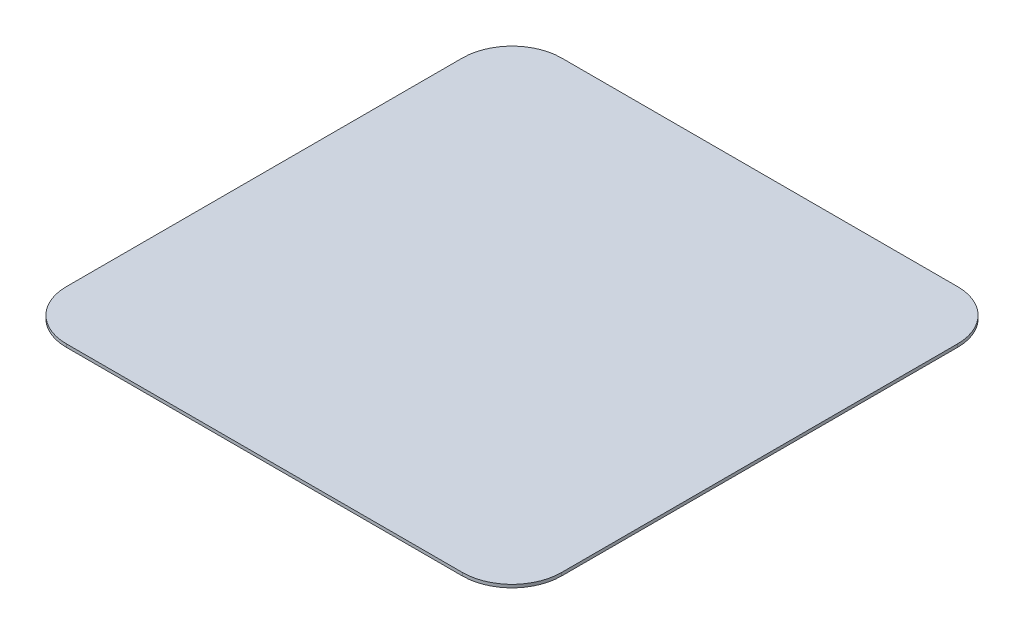
ISO-10303-21;
HEADER;
FILE_DESCRIPTION(('STEP AP214'),'2;1');
FILE_NAME('part.step','',(''),(''),'','','');
FILE_SCHEMA(('AUTOMOTIVE_DESIGN { 1 0 10303 214 1 1 1 1 }'));
ENDSEC;
DATA;
#1=APPLICATION_CONTEXT('core data for automotive mechanical design processes');
#2=APPLICATION_PROTOCOL_DEFINITION('international standard','automotive_design',2000,#1);
#3=PRODUCT_CONTEXT('',#1,'mechanical');
#4=PRODUCT('Part','Part','',(#3));
#5=PRODUCT_RELATED_PRODUCT_CATEGORY('part','',(#4));
#6=PRODUCT_DEFINITION_FORMATION('','',#4);
#7=PRODUCT_DEFINITION_CONTEXT('part definition',#1,'design');
#8=PRODUCT_DEFINITION('design','',#6,#7);
#9=PRODUCT_DEFINITION_SHAPE('','',#8);
#10=(LENGTH_UNIT() NAMED_UNIT(*) SI_UNIT(.MILLI.,.METRE.));
#11=(NAMED_UNIT(*) PLANE_ANGLE_UNIT() SI_UNIT($,.RADIAN.));
#12=(NAMED_UNIT(*) SI_UNIT($,.STERADIAN.) SOLID_ANGLE_UNIT());
#13=UNCERTAINTY_MEASURE_WITH_UNIT(LENGTH_MEASURE(1.E-05),#10,'distance_accuracy_value','');
#14=(GEOMETRIC_REPRESENTATION_CONTEXT(3) GLOBAL_UNCERTAINTY_ASSIGNED_CONTEXT((#13)) GLOBAL_UNIT_ASSIGNED_CONTEXT((#10,
#11,#12)) REPRESENTATION_CONTEXT('',''));
#15=CARTESIAN_POINT('',(0.,0.,0.));
#16=DIRECTION('',(0.,0.,1.));
#17=DIRECTION('',(1.,0.,0.));
#18=AXIS2_PLACEMENT_3D('',#15,#16,#17);
#19=CARTESIAN_POINT('',(47.5808065608511,26.1212463535826,-65.0344357125784));
#20=DIRECTION('',(0.,-1.,0.));
#21=DIRECTION('',(0.,0.,-1.));
#22=AXIS2_PLACEMENT_3D('',#19,#20,#21);
#23=CYLINDRICAL_SURFACE('',#22,12.7);
#24=CARTESIAN_POINT('',(47.5808065608511,25.3274963535826,-65.0344357125784));
#25=DIRECTION('',(0.,1.,0.));
#26=DIRECTION('',(0.,0.,1.));
#27=AXIS2_PLACEMENT_3D('',#24,#25,#26);
#28=CIRCLE('',#27,12.7);
#29=CARTESIAN_POINT('',(60.2808065608511,25.3274963535826,-65.0344357125784));
#30=VERTEX_POINT('',#29);
#31=CARTESIAN_POINT('',(47.5808065608511,25.3274963535826,-77.7344357125784));
#32=VERTEX_POINT('',#31);
#33=EDGE_CURVE('E129',#30,#32,#28,.T.);
#34=ORIENTED_EDGE('',*,*,#33,.T.);
#35=DIRECTION('',(0.,-1.,0.));
#36=VECTOR('',#35,1.);
#37=CARTESIAN_POINT('',(47.5808065608511,26.1212463535826,-77.7344357125784));
#38=LINE('',#37,#36);
#39=CARTESIAN_POINT('',(47.5808065608511,26.1212463535826,-77.7344357125784));
#40=VERTEX_POINT('',#39);
#41=EDGE_CURVE('E11',#40,#32,#38,.T.);
#42=ORIENTED_EDGE('',*,*,#41,.F.);
#43=CARTESIAN_POINT('',(47.5808065608511,26.1212463535826,-65.0344357125784));
#44=DIRECTION('',(0.,1.,0.));
#45=DIRECTION('',(0.,0.,1.));
#46=AXIS2_PLACEMENT_3D('',#43,#44,#45);
#47=CIRCLE('',#46,12.7);
#48=CARTESIAN_POINT('',(60.2808065608511,26.1212463535826,-65.0344357125784));
#49=VERTEX_POINT('',#48);
#50=EDGE_CURVE('E143',#49,#40,#47,.T.);
#51=ORIENTED_EDGE('',*,*,#50,.F.);
#52=DIRECTION('',(0.,-1.,0.));
#53=VECTOR('',#52,1.);
#54=CARTESIAN_POINT('',(60.2808065608511,26.1212463535826,-65.0344357125784));
#55=LINE('',#54,#53);
#56=EDGE_CURVE('E125',#49,#30,#55,.T.);
#57=ORIENTED_EDGE('',*,*,#56,.T.);
#58=EDGE_LOOP('',(#34,#42,#51,#57));
#59=FACE_BOUND('',#58,.T.);
#60=ADVANCED_FACE('F33',(#59),#23,.T.);
#61=CARTESIAN_POINT('',(47.5808065608511,26.1212463535826,-77.7344357125784));
#62=DIRECTION('',(0.,0.,1.));
#63=DIRECTION('',(1.,0.,0.));
#64=AXIS2_PLACEMENT_3D('',#61,#62,#63);
#65=PLANE('',#64);
#66=DIRECTION('',(-1.,0.,0.));
#67=VECTOR('',#66,1.);
#68=CARTESIAN_POINT('',(47.5808065608511,25.3274963535826,-77.7344357125784));
#69=LINE('',#68,#67);
#70=CARTESIAN_POINT('',(-54.0191934391488,25.3274963535826,-77.7344357125784));
#71=VERTEX_POINT('',#70);
#72=EDGE_CURVE('E132',#32,#71,#69,.T.);
#73=ORIENTED_EDGE('',*,*,#72,.T.);
#74=DIRECTION('',(0.,-1.,0.));
#75=VECTOR('',#74,1.);
#76=CARTESIAN_POINT('',(-54.0191934391488,26.1212463535826,-77.7344357125784));
#77=LINE('',#76,#75);
#78=CARTESIAN_POINT('',(-54.0191934391488,26.1212463535826,-77.7344357125784));
#79=VERTEX_POINT('',#78);
#80=EDGE_CURVE('E41',#79,#71,#77,.T.);
#81=ORIENTED_EDGE('',*,*,#80,.F.);
#82=DIRECTION('',(-1.,0.,0.));
#83=VECTOR('',#82,1.);
#84=CARTESIAN_POINT('',(47.5808065608511,26.1212463535826,-77.7344357125784));
#85=LINE('',#84,#83);
#86=EDGE_CURVE('E92',#40,#79,#85,.T.);
#87=ORIENTED_EDGE('',*,*,#86,.F.);
#88=ORIENTED_EDGE('',*,*,#41,.T.);
#89=EDGE_LOOP('',(#73,#81,#87,#88));
#90=FACE_BOUND('',#89,.T.);
#91=ADVANCED_FACE('F178',(#90),#65,.F.);
#92=CARTESIAN_POINT('',(-54.0191934391488,26.1212463535826,-65.0344357125784));
#93=DIRECTION('',(0.,-1.,0.));
#94=DIRECTION('',(0.,0.,-1.));
#95=AXIS2_PLACEMENT_3D('',#92,#93,#94);
#96=CYLINDRICAL_SURFACE('',#95,12.7);
#97=CARTESIAN_POINT('',(-54.0191934391488,25.3274963535826,-65.0344357125784));
#98=DIRECTION('',(0.,1.,0.));
#99=DIRECTION('',(0.,0.,1.));
#100=AXIS2_PLACEMENT_3D('',#97,#98,#99);
#101=CIRCLE('',#100,12.7);
#102=CARTESIAN_POINT('',(-66.7191934391488,25.3274963535826,-65.0344357125784));
#103=VERTEX_POINT('',#102);
#104=EDGE_CURVE('E134',#71,#103,#101,.T.);
#105=ORIENTED_EDGE('',*,*,#104,.T.);
#106=DIRECTION('',(0.,-1.,0.));
#107=VECTOR('',#106,1.);
#108=CARTESIAN_POINT('',(-66.7191934391488,26.1212463535826,-65.0344357125784));
#109=LINE('',#108,#107);
#110=CARTESIAN_POINT('',(-66.7191934391488,26.1212463535826,-65.0344357125784));
#111=VERTEX_POINT('',#110);
#112=EDGE_CURVE('E150',#111,#103,#109,.T.);
#113=ORIENTED_EDGE('',*,*,#112,.F.);
#114=CARTESIAN_POINT('',(-54.0191934391488,26.1212463535826,-65.0344357125784));
#115=DIRECTION('',(0.,1.,0.));
#116=DIRECTION('',(0.,0.,1.));
#117=AXIS2_PLACEMENT_3D('',#114,#115,#116);
#118=CIRCLE('',#117,12.7);
#119=EDGE_CURVE('E158',#79,#111,#118,.T.);
#120=ORIENTED_EDGE('',*,*,#119,.F.);
#121=ORIENTED_EDGE('',*,*,#80,.T.);
#122=EDGE_LOOP('',(#105,#113,#120,#121));
#123=FACE_BOUND('',#122,.T.);
#124=ADVANCED_FACE('F156',(#123),#96,.T.);
#125=CARTESIAN_POINT('',(-66.7191934391488,26.1212463535826,-65.0344357125784));
#126=DIRECTION('',(1.,0.,0.));
#127=DIRECTION('',(0.,0.,-1.));
#128=AXIS2_PLACEMENT_3D('',#125,#126,#127);
#129=PLANE('',#128);
#130=DIRECTION('',(0.,0.,1.));
#131=VECTOR('',#130,1.);
#132=CARTESIAN_POINT('',(-66.7191934391488,25.3274963535826,-65.0344357125784));
#133=LINE('',#132,#131);
#134=CARTESIAN_POINT('',(-66.7191934391488,25.3274963535826,36.5655642874217));
#135=VERTEX_POINT('',#134);
#136=EDGE_CURVE('E136',#103,#135,#133,.T.);
#137=ORIENTED_EDGE('',*,*,#136,.T.);
#138=DIRECTION('',(0.,-1.,0.));
#139=VECTOR('',#138,1.);
#140=CARTESIAN_POINT('',(-66.7191934391488,26.1212463535826,36.5655642874217));
#141=LINE('',#140,#139);
#142=CARTESIAN_POINT('',(-66.7191934391488,26.1212463535826,36.5655642874217));
#143=VERTEX_POINT('',#142);
#144=EDGE_CURVE('E147',#143,#135,#141,.T.);
#145=ORIENTED_EDGE('',*,*,#144,.F.);
#146=DIRECTION('',(0.,0.,1.));
#147=VECTOR('',#146,1.);
#148=CARTESIAN_POINT('',(-66.7191934391488,26.1212463535826,-65.0344357125784));
#149=LINE('',#148,#147);
#150=EDGE_CURVE('E170',#111,#143,#149,.T.);
#151=ORIENTED_EDGE('',*,*,#150,.F.);
#152=ORIENTED_EDGE('',*,*,#112,.T.);
#153=EDGE_LOOP('',(#137,#145,#151,#152));
#154=FACE_BOUND('',#153,.T.);
#155=ADVANCED_FACE('F166',(#154),#129,.F.);
#156=CARTESIAN_POINT('',(-54.0191934391488,26.1212463535826,36.5655642874216));
#157=DIRECTION('',(0.,-1.,0.));
#158=DIRECTION('',(0.,0.,-1.));
#159=AXIS2_PLACEMENT_3D('',#156,#157,#158);
#160=CYLINDRICAL_SURFACE('',#159,12.7);
#161=CARTESIAN_POINT('',(-54.0191934391488,25.3274963535826,36.5655642874216));
#162=DIRECTION('',(0.,1.,0.));
#163=DIRECTION('',(0.,0.,1.));
#164=AXIS2_PLACEMENT_3D('',#161,#162,#163);
#165=CIRCLE('',#164,12.7);
#166=CARTESIAN_POINT('',(-54.0191934391488,25.3274963535826,49.2655642874216));
#167=VERTEX_POINT('',#166);
#168=EDGE_CURVE('E138',#135,#167,#165,.T.);
#169=ORIENTED_EDGE('',*,*,#168,.T.);
#170=DIRECTION('',(0.,-1.,0.));
#171=VECTOR('',#170,1.);
#172=CARTESIAN_POINT('',(-54.0191934391488,26.1212463535826,49.2655642874216));
#173=LINE('',#172,#171);
#174=CARTESIAN_POINT('',(-54.0191934391488,26.1212463535826,49.2655642874216));
#175=VERTEX_POINT('',#174);
#176=EDGE_CURVE('E120',#175,#167,#173,.T.);
#177=ORIENTED_EDGE('',*,*,#176,.F.);
#178=CARTESIAN_POINT('',(-54.0191934391488,26.1212463535826,36.5655642874216));
#179=DIRECTION('',(0.,1.,0.));
#180=DIRECTION('',(0.,0.,1.));
#181=AXIS2_PLACEMENT_3D('',#178,#179,#180);
#182=CIRCLE('',#181,12.7);
#183=EDGE_CURVE('E111',#143,#175,#182,.T.);
#184=ORIENTED_EDGE('',*,*,#183,.F.);
#185=ORIENTED_EDGE('',*,*,#144,.T.);
#186=EDGE_LOOP('',(#169,#177,#184,#185));
#187=FACE_BOUND('',#186,.T.);
#188=ADVANCED_FACE('F169',(#187),#160,.T.);
#189=CARTESIAN_POINT('',(-54.0191934391488,26.1212463535826,49.2655642874216));
#190=DIRECTION('',(0.,0.,-1.));
#191=DIRECTION('',(-1.,0.,0.));
#192=AXIS2_PLACEMENT_3D('',#189,#190,#191);
#193=PLANE('',#192);
#194=DIRECTION('',(1.,0.,0.));
#195=VECTOR('',#194,1.);
#196=CARTESIAN_POINT('',(-54.0191934391488,25.3274963535826,49.2655642874216));
#197=LINE('',#196,#195);
#198=CARTESIAN_POINT('',(47.5808065608511,25.3274963535826,49.2655642874217));
#199=VERTEX_POINT('',#198);
#200=EDGE_CURVE('E119',#167,#199,#197,.T.);
#201=ORIENTED_EDGE('',*,*,#200,.T.);
#202=DIRECTION('',(0.,-1.,0.));
#203=VECTOR('',#202,1.);
#204=CARTESIAN_POINT('',(47.5808065608511,26.1212463535826,49.2655642874217));
#205=LINE('',#204,#203);
#206=CARTESIAN_POINT('',(47.5808065608511,26.1212463535826,49.2655642874217));
#207=VERTEX_POINT('',#206);
#208=EDGE_CURVE('E116',#207,#199,#205,.T.);
#209=ORIENTED_EDGE('',*,*,#208,.F.);
#210=DIRECTION('',(1.,0.,0.));
#211=VECTOR('',#210,1.);
#212=CARTESIAN_POINT('',(-54.0191934391488,26.1212463535826,49.2655642874216));
#213=LINE('',#212,#211);
#214=EDGE_CURVE('E105',#175,#207,#213,.T.);
#215=ORIENTED_EDGE('',*,*,#214,.F.);
#216=ORIENTED_EDGE('',*,*,#176,.T.);
#217=EDGE_LOOP('',(#201,#209,#215,#216));
#218=FACE_BOUND('',#217,.T.);
#219=ADVANCED_FACE('F117',(#218),#193,.F.);
#220=CARTESIAN_POINT('',(47.5808065608511,26.1212463535826,36.5655642874216));
#221=DIRECTION('',(0.,-1.,0.));
#222=DIRECTION('',(0.,0.,-1.));
#223=AXIS2_PLACEMENT_3D('',#220,#221,#222);
#224=CYLINDRICAL_SURFACE('',#223,12.7);
#225=CARTESIAN_POINT('',(47.5808065608511,25.3274963535826,36.5655642874216));
#226=DIRECTION('',(0.,1.,0.));
#227=DIRECTION('',(0.,0.,1.));
#228=AXIS2_PLACEMENT_3D('',#225,#226,#227);
#229=CIRCLE('',#228,12.7);
#230=CARTESIAN_POINT('',(60.2808065608512,25.3274963535826,36.5655642874217));
#231=VERTEX_POINT('',#230);
#232=EDGE_CURVE('E78',#199,#231,#229,.T.);
#233=ORIENTED_EDGE('',*,*,#232,.T.);
#234=DIRECTION('',(0.,-1.,0.));
#235=VECTOR('',#234,1.);
#236=CARTESIAN_POINT('',(60.2808065608512,26.1212463535826,36.5655642874217));
#237=LINE('',#236,#235);
#238=CARTESIAN_POINT('',(60.2808065608512,26.1212463535826,36.5655642874217));
#239=VERTEX_POINT('',#238);
#240=EDGE_CURVE('E121',#239,#231,#237,.T.);
#241=ORIENTED_EDGE('',*,*,#240,.F.);
#242=CARTESIAN_POINT('',(47.5808065608511,26.1212463535826,36.5655642874216));
#243=DIRECTION('',(0.,1.,0.));
#244=DIRECTION('',(0.,0.,1.));
#245=AXIS2_PLACEMENT_3D('',#242,#243,#244);
#246=CIRCLE('',#245,12.7);
#247=EDGE_CURVE('E109',#207,#239,#246,.T.);
#248=ORIENTED_EDGE('',*,*,#247,.F.);
#249=ORIENTED_EDGE('',*,*,#208,.T.);
#250=EDGE_LOOP('',(#233,#241,#248,#249));
#251=FACE_BOUND('',#250,.T.);
#252=ADVANCED_FACE('F123',(#251),#224,.T.);
#253=CARTESIAN_POINT('',(60.2808065608512,26.1212463535826,36.5655642874217));
#254=DIRECTION('',(-1.,0.,0.));
#255=DIRECTION('',(0.,0.,1.));
#256=AXIS2_PLACEMENT_3D('',#253,#254,#255);
#257=PLANE('',#256);
#258=DIRECTION('',(0.,0.,-1.));
#259=VECTOR('',#258,1.);
#260=CARTESIAN_POINT('',(60.2808065608512,25.3274963535826,36.5655642874217));
#261=LINE('',#260,#259);
#262=EDGE_CURVE('E84',#231,#30,#261,.T.);
#263=ORIENTED_EDGE('',*,*,#262,.T.);
#264=ORIENTED_EDGE('',*,*,#56,.F.);
#265=DIRECTION('',(0.,0.,-1.));
#266=VECTOR('',#265,1.);
#267=CARTESIAN_POINT('',(60.2808065608512,26.1212463535826,36.5655642874217));
#268=LINE('',#267,#266);
#269=EDGE_CURVE('E49',#239,#49,#268,.T.);
#270=ORIENTED_EDGE('',*,*,#269,.F.);
#271=ORIENTED_EDGE('',*,*,#240,.T.);
#272=EDGE_LOOP('',(#263,#264,#270,#271));
#273=FACE_BOUND('',#272,.T.);
#274=ADVANCED_FACE('F194',(#273),#257,.F.);
#275=CARTESIAN_POINT('',(47.5808065608511,26.1212463535826,-65.0344357125784));
#276=DIRECTION('',(0.,1.,0.));
#277=DIRECTION('',(0.,0.,1.));
#278=AXIS2_PLACEMENT_3D('',#275,#276,#277);
#279=PLANE('',#278);
#280=ORIENTED_EDGE('',*,*,#50,.T.);
#281=ORIENTED_EDGE('',*,*,#86,.T.);
#282=ORIENTED_EDGE('',*,*,#119,.T.);
#283=ORIENTED_EDGE('',*,*,#150,.T.);
#284=ORIENTED_EDGE('',*,*,#183,.T.);
#285=ORIENTED_EDGE('',*,*,#214,.T.);
#286=ORIENTED_EDGE('',*,*,#247,.T.);
#287=ORIENTED_EDGE('',*,*,#269,.T.);
#288=EDGE_LOOP('',(#280,#281,#282,#283,#284,#285,#286,#287));
#289=FACE_BOUND('',#288,.T.);
#290=ADVANCED_FACE('F107',(#289),#279,.T.);
#291=CARTESIAN_POINT('',(47.5808065608511,25.3274963535826,-65.0344357125784));
#292=DIRECTION('',(0.,1.,0.));
#293=DIRECTION('',(0.,0.,1.));
#294=AXIS2_PLACEMENT_3D('',#291,#292,#293);
#295=PLANE('',#294);
#296=ORIENTED_EDGE('',*,*,#33,.F.);
#297=ORIENTED_EDGE('',*,*,#262,.F.);
#298=ORIENTED_EDGE('',*,*,#232,.F.);
#299=ORIENTED_EDGE('',*,*,#200,.F.);
#300=ORIENTED_EDGE('',*,*,#168,.F.);
#301=ORIENTED_EDGE('',*,*,#136,.F.);
#302=ORIENTED_EDGE('',*,*,#104,.F.);
#303=ORIENTED_EDGE('',*,*,#72,.F.);
#304=EDGE_LOOP('',(#296,#297,#298,#299,#300,#301,#302,#303));
#305=FACE_BOUND('',#304,.T.);
#306=ADVANCED_FACE('F162',(#305),#295,.F.);
#307=CLOSED_SHELL('',(#60,#91,#124,#155,#188,#219,#252,#274,#290,#306));
#308=MANIFOLD_SOLID_BREP('B2',#307);
#309=ADVANCED_BREP_SHAPE_REPRESENTATION('',(#18,#308),#14);
#310=SHAPE_DEFINITION_REPRESENTATION(#9,#309);
ENDSEC;
END-ISO-10303-21;
